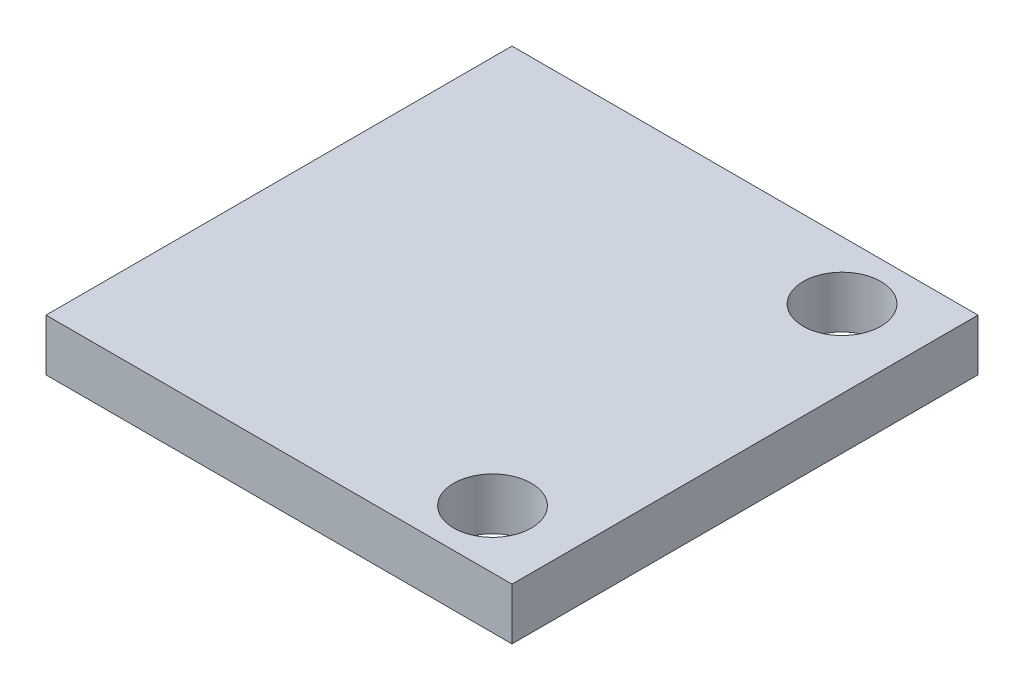
ISO-10303-21;
HEADER;
FILE_DESCRIPTION(('STEP AP214'),'2;1');
FILE_NAME('part.step','',(''),(''),'','','');
FILE_SCHEMA(('AUTOMOTIVE_DESIGN { 1 0 10303 214 1 1 1 1 }'));
ENDSEC;
DATA;
#1=APPLICATION_CONTEXT('core data for automotive mechanical design processes');
#2=APPLICATION_PROTOCOL_DEFINITION('international standard','automotive_design',2000,#1);
#3=PRODUCT_CONTEXT('',#1,'mechanical');
#4=PRODUCT('Part','Part','',(#3));
#5=PRODUCT_RELATED_PRODUCT_CATEGORY('part','',(#4));
#6=PRODUCT_DEFINITION_FORMATION('','',#4);
#7=PRODUCT_DEFINITION_CONTEXT('part definition',#1,'design');
#8=PRODUCT_DEFINITION('design','',#6,#7);
#9=PRODUCT_DEFINITION_SHAPE('','',#8);
#10=(LENGTH_UNIT() NAMED_UNIT(*) SI_UNIT(.MILLI.,.METRE.));
#11=(NAMED_UNIT(*) PLANE_ANGLE_UNIT() SI_UNIT($,.RADIAN.));
#12=(NAMED_UNIT(*) SI_UNIT($,.STERADIAN.) SOLID_ANGLE_UNIT());
#13=UNCERTAINTY_MEASURE_WITH_UNIT(LENGTH_MEASURE(1.E-05),#10,'distance_accuracy_value','');
#14=(GEOMETRIC_REPRESENTATION_CONTEXT(3) GLOBAL_UNCERTAINTY_ASSIGNED_CONTEXT((#13)) GLOBAL_UNIT_ASSIGNED_CONTEXT((#10,
#11,#12)) REPRESENTATION_CONTEXT('',''));
#15=CARTESIAN_POINT('',(0.,0.,0.));
#16=DIRECTION('',(0.,0.,1.));
#17=DIRECTION('',(1.,0.,0.));
#18=AXIS2_PLACEMENT_3D('',#15,#16,#17);
#19=CARTESIAN_POINT('',(5.46916469121233,2.,10.2032585681524));
#20=DIRECTION('',(0.,0.,-1.));
#21=DIRECTION('',(-1.,0.,0.));
#22=AXIS2_PLACEMENT_3D('',#19,#20,#21);
#23=PLANE('',#22);
#24=DIRECTION('',(1.,0.,0.));
#25=VECTOR('',#24,1.);
#26=CARTESIAN_POINT('',(5.46916469121233,0.,10.2032585681524));
#27=LINE('',#26,#25);
#28=CARTESIAN_POINT('',(5.46916469121233,0.,10.2032585681524));
#29=VERTEX_POINT('',#28);
#30=CARTESIAN_POINT('',(23.4691646912123,0.,10.2032585681524));
#31=VERTEX_POINT('',#30);
#32=EDGE_CURVE('E106',#29,#31,#27,.T.);
#33=ORIENTED_EDGE('',*,*,#32,.T.);
#34=DIRECTION('',(0.,-1.,0.));
#35=VECTOR('',#34,1.);
#36=CARTESIAN_POINT('',(23.4691646912123,2.,10.2032585681524));
#37=LINE('',#36,#35);
#38=CARTESIAN_POINT('',(23.4691646912123,2.,10.2032585681524));
#39=VERTEX_POINT('',#38);
#40=EDGE_CURVE('E11',#39,#31,#37,.T.);
#41=ORIENTED_EDGE('',*,*,#40,.F.);
#42=DIRECTION('',(1.,0.,0.));
#43=VECTOR('',#42,1.);
#44=CARTESIAN_POINT('',(5.46916469121233,2.,10.2032585681524));
#45=LINE('',#44,#43);
#46=CARTESIAN_POINT('',(5.46916469121233,2.,10.2032585681524));
#47=VERTEX_POINT('',#46);
#48=EDGE_CURVE('E79',#47,#39,#45,.T.);
#49=ORIENTED_EDGE('',*,*,#48,.F.);
#50=DIRECTION('',(0.,-1.,0.));
#51=VECTOR('',#50,1.);
#52=CARTESIAN_POINT('',(5.46916469121233,2.,10.2032585681524));
#53=LINE('',#52,#51);
#54=EDGE_CURVE('E102',#47,#29,#53,.T.);
#55=ORIENTED_EDGE('',*,*,#54,.T.);
#56=EDGE_LOOP('',(#33,#41,#49,#55));
#57=FACE_BOUND('',#56,.T.);
#58=ADVANCED_FACE('F39',(#57),#23,.F.);
#59=CARTESIAN_POINT('',(23.4691646912123,2.,-7.7967414318476));
#60=DIRECTION('',(1.,0.,0.));
#61=DIRECTION('',(0.,0.,-1.));
#62=AXIS2_PLACEMENT_3D('',#59,#60,#61);
#63=PLANE('',#62);
#64=DIRECTION('',(0.,0.,1.));
#65=VECTOR('',#64,1.);
#66=CARTESIAN_POINT('',(23.4691646912123,0.,-7.7967414318476));
#67=LINE('',#66,#65);
#68=CARTESIAN_POINT('',(23.4691646912123,0.,-7.7967414318476));
#69=VERTEX_POINT('',#68);
#70=EDGE_CURVE('E88',#69,#31,#67,.T.);
#71=ORIENTED_EDGE('',*,*,#70,.F.);
#72=DIRECTION('',(0.,-1.,0.));
#73=VECTOR('',#72,1.);
#74=CARTESIAN_POINT('',(23.4691646912123,2.,-7.7967414318476));
#75=LINE('',#74,#73);
#76=CARTESIAN_POINT('',(23.4691646912123,2.,-7.7967414318476));
#77=VERTEX_POINT('',#76);
#78=EDGE_CURVE('E48',#77,#69,#75,.T.);
#79=ORIENTED_EDGE('',*,*,#78,.F.);
#80=DIRECTION('',(0.,0.,1.));
#81=VECTOR('',#80,1.);
#82=CARTESIAN_POINT('',(23.4691646912123,2.,-7.7967414318476));
#83=LINE('',#82,#81);
#84=EDGE_CURVE('E86',#77,#39,#83,.T.);
#85=ORIENTED_EDGE('',*,*,#84,.T.);
#86=ORIENTED_EDGE('',*,*,#40,.T.);
#87=EDGE_LOOP('',(#71,#79,#85,#86));
#88=FACE_BOUND('',#87,.T.);
#89=ADVANCED_FACE('F85',(#88),#63,.T.);
#90=CARTESIAN_POINT('',(5.46916469121233,2.,-7.7967414318476));
#91=DIRECTION('',(0.,0.,-1.));
#92=DIRECTION('',(-1.,0.,0.));
#93=AXIS2_PLACEMENT_3D('',#90,#91,#92);
#94=PLANE('',#93);
#95=DIRECTION('',(1.,0.,0.));
#96=VECTOR('',#95,1.);
#97=CARTESIAN_POINT('',(5.46916469121233,0.,-7.7967414318476));
#98=LINE('',#97,#96);
#99=CARTESIAN_POINT('',(5.46916469121233,0.,-7.7967414318476));
#100=VERTEX_POINT('',#99);
#101=EDGE_CURVE('E113',#100,#69,#98,.T.);
#102=ORIENTED_EDGE('',*,*,#101,.F.);
#103=DIRECTION('',(0.,-1.,0.));
#104=VECTOR('',#103,1.);
#105=CARTESIAN_POINT('',(5.46916469121233,2.,-7.7967414318476));
#106=LINE('',#105,#104);
#107=CARTESIAN_POINT('',(5.46916469121233,2.,-7.7967414318476));
#108=VERTEX_POINT('',#107);
#109=EDGE_CURVE('E71',#108,#100,#106,.T.);
#110=ORIENTED_EDGE('',*,*,#109,.F.);
#111=DIRECTION('',(1.,0.,0.));
#112=VECTOR('',#111,1.);
#113=CARTESIAN_POINT('',(5.46916469121233,2.,-7.7967414318476));
#114=LINE('',#113,#112);
#115=EDGE_CURVE('E95',#108,#77,#114,.T.);
#116=ORIENTED_EDGE('',*,*,#115,.T.);
#117=ORIENTED_EDGE('',*,*,#78,.T.);
#118=EDGE_LOOP('',(#102,#110,#116,#117));
#119=FACE_BOUND('',#118,.T.);
#120=ADVANCED_FACE('F98',(#119),#94,.T.);
#121=CARTESIAN_POINT('',(5.46916469121233,2.,-7.7967414318476));
#122=DIRECTION('',(1.,0.,0.));
#123=DIRECTION('',(0.,0.,-1.));
#124=AXIS2_PLACEMENT_3D('',#121,#122,#123);
#125=PLANE('',#124);
#126=DIRECTION('',(0.,0.,1.));
#127=VECTOR('',#126,1.);
#128=CARTESIAN_POINT('',(5.46916469121233,0.,-7.7967414318476));
#129=LINE('',#128,#127);
#130=EDGE_CURVE('E74',#100,#29,#129,.T.);
#131=ORIENTED_EDGE('',*,*,#130,.T.);
#132=ORIENTED_EDGE('',*,*,#54,.F.);
#133=DIRECTION('',(0.,0.,1.));
#134=VECTOR('',#133,1.);
#135=CARTESIAN_POINT('',(5.46916469121233,2.,-7.7967414318476));
#136=LINE('',#135,#134);
#137=EDGE_CURVE('E56',#108,#47,#136,.T.);
#138=ORIENTED_EDGE('',*,*,#137,.F.);
#139=ORIENTED_EDGE('',*,*,#109,.T.);
#140=EDGE_LOOP('',(#131,#132,#138,#139));
#141=FACE_BOUND('',#140,.T.);
#142=ADVANCED_FACE('F136',(#141),#125,.F.);
#143=CARTESIAN_POINT('',(0.,2.,0.));
#144=DIRECTION('',(0.,-1.,0.));
#145=DIRECTION('',(0.,0.,-1.));
#146=AXIS2_PLACEMENT_3D('',#143,#144,#145);
#147=PLANE('',#146);
#148=CARTESIAN_POINT('',(20.4673869096289,2.,-5.5467414318476));
#149=DIRECTION('',(0.,1.,0.));
#150=DIRECTION('',(0.,0.,1.));
#151=AXIS2_PLACEMENT_3D('',#148,#149,#150);
#152=CIRCLE('',#151,1.5);
#153=CARTESIAN_POINT('',(20.4673869096289,2.,-4.0467414318476));
#154=VERTEX_POINT('',#153);
#155=EDGE_CURVE('E186',#154,#154,#152,.T.);
#156=ORIENTED_EDGE('',*,*,#155,.F.);
#157=EDGE_LOOP('',(#156));
#158=FACE_BOUND('',#157,.T.);
#159=CARTESIAN_POINT('',(20.4673869096289,2.,7.9532585681524));
#160=DIRECTION('',(0.,1.,0.));
#161=DIRECTION('',(0.,0.,1.));
#162=AXIS2_PLACEMENT_3D('',#159,#160,#161);
#163=CIRCLE('',#162,1.5);
#164=CARTESIAN_POINT('',(20.4673869096289,2.,9.4532585681524));
#165=VERTEX_POINT('',#164);
#166=EDGE_CURVE('E194',#165,#165,#163,.T.);
#167=ORIENTED_EDGE('',*,*,#166,.F.);
#168=EDGE_LOOP('',(#167));
#169=FACE_BOUND('',#168,.T.);
#170=ORIENTED_EDGE('',*,*,#48,.T.);
#171=ORIENTED_EDGE('',*,*,#84,.F.);
#172=ORIENTED_EDGE('',*,*,#115,.F.);
#173=ORIENTED_EDGE('',*,*,#137,.T.);
#174=EDGE_LOOP('',(#170,#171,#172,#173));
#175=FACE_BOUND('',#174,.T.);
#176=ADVANCED_FACE('F94',(#158,#169,#175),#147,.F.);
#177=CARTESIAN_POINT('',(0.,0.,0.));
#178=DIRECTION('',(0.,-1.,0.));
#179=DIRECTION('',(0.,0.,-1.));
#180=AXIS2_PLACEMENT_3D('',#177,#178,#179);
#181=PLANE('',#180);
#182=CARTESIAN_POINT('',(20.4673869096289,0.,-5.5467414318476));
#183=DIRECTION('',(0.,1.,0.));
#184=DIRECTION('',(0.,0.,1.));
#185=AXIS2_PLACEMENT_3D('',#182,#183,#184);
#186=CIRCLE('',#185,1.5);
#187=CARTESIAN_POINT('',(20.4673869096289,0.,-4.0467414318476));
#188=VERTEX_POINT('',#187);
#189=EDGE_CURVE('E110',#188,#188,#186,.T.);
#190=ORIENTED_EDGE('',*,*,#189,.T.);
#191=EDGE_LOOP('',(#190));
#192=FACE_BOUND('',#191,.T.);
#193=CARTESIAN_POINT('',(20.4673869096289,0.,7.9532585681524));
#194=DIRECTION('',(0.,1.,0.));
#195=DIRECTION('',(0.,0.,1.));
#196=AXIS2_PLACEMENT_3D('',#193,#194,#195);
#197=CIRCLE('',#196,1.5);
#198=CARTESIAN_POINT('',(20.4673869096289,0.,9.4532585681524));
#199=VERTEX_POINT('',#198);
#200=EDGE_CURVE('E188',#199,#199,#197,.T.);
#201=ORIENTED_EDGE('',*,*,#200,.T.);
#202=EDGE_LOOP('',(#201));
#203=FACE_BOUND('',#202,.T.);
#204=ORIENTED_EDGE('',*,*,#32,.F.);
#205=ORIENTED_EDGE('',*,*,#130,.F.);
#206=ORIENTED_EDGE('',*,*,#101,.T.);
#207=ORIENTED_EDGE('',*,*,#70,.T.);
#208=EDGE_LOOP('',(#204,#205,#206,#207));
#209=FACE_BOUND('',#208,.T.);
#210=ADVANCED_FACE('F124',(#192,#203,#209),#181,.T.);
#211=CARTESIAN_POINT('',(20.4673869096289,0.,7.9532585681524));
#212=DIRECTION('',(0.,1.,0.));
#213=DIRECTION('',(0.,0.,1.));
#214=AXIS2_PLACEMENT_3D('',#211,#212,#213);
#215=CYLINDRICAL_SURFACE('',#214,1.5);
#216=ORIENTED_EDGE('',*,*,#200,.F.);
#217=EDGE_LOOP('',(#216));
#218=FACE_BOUND('',#217,.T.);
#219=ORIENTED_EDGE('',*,*,#166,.T.);
#220=EDGE_LOOP('',(#219));
#221=FACE_BOUND('',#220,.T.);
#222=ADVANCED_FACE('F126',(#218,#221),#215,.F.);
#223=CARTESIAN_POINT('',(20.4673869096289,0.,-5.5467414318476));
#224=DIRECTION('',(0.,1.,0.));
#225=DIRECTION('',(0.,0.,1.));
#226=AXIS2_PLACEMENT_3D('',#223,#224,#225);
#227=CYLINDRICAL_SURFACE('',#226,1.5);
#228=ORIENTED_EDGE('',*,*,#189,.F.);
#229=EDGE_LOOP('',(#228));
#230=FACE_BOUND('',#229,.T.);
#231=ORIENTED_EDGE('',*,*,#155,.T.);
#232=EDGE_LOOP('',(#231));
#233=FACE_BOUND('',#232,.T.);
#234=ADVANCED_FACE('F133',(#230,#233),#227,.F.);
#235=CLOSED_SHELL('',(#58,#89,#120,#142,#176,#210,#222,#234));
#236=MANIFOLD_SOLID_BREP('B2',#235);
#237=ADVANCED_BREP_SHAPE_REPRESENTATION('',(#18,#236),#14);
#238=SHAPE_DEFINITION_REPRESENTATION(#9,#237);
ENDSEC;
END-ISO-10303-21;
